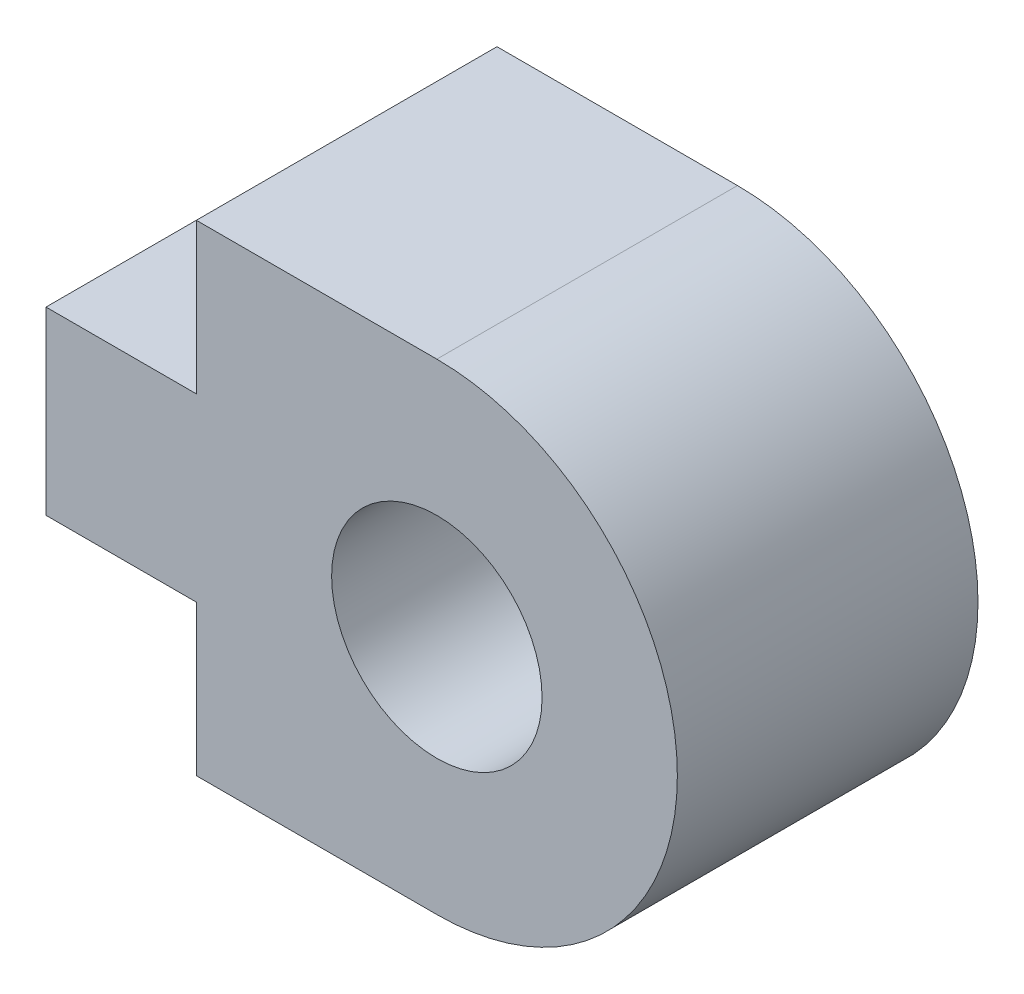
ISO-10303-21;
HEADER;
FILE_DESCRIPTION(('STEP AP214'),'2;1');
FILE_NAME('part.step','',(''),(''),'','','');
FILE_SCHEMA(('AUTOMOTIVE_DESIGN { 1 0 10303 214 1 1 1 1 }'));
ENDSEC;
DATA;
#1=APPLICATION_CONTEXT('core data for automotive mechanical design processes');
#2=APPLICATION_PROTOCOL_DEFINITION('international standard','automotive_design',2000,#1);
#3=PRODUCT_CONTEXT('',#1,'mechanical');
#4=PRODUCT('Part','Part','',(#3));
#5=PRODUCT_RELATED_PRODUCT_CATEGORY('part','',(#4));
#6=PRODUCT_DEFINITION_FORMATION('','',#4);
#7=PRODUCT_DEFINITION_CONTEXT('part definition',#1,'design');
#8=PRODUCT_DEFINITION('design','',#6,#7);
#9=PRODUCT_DEFINITION_SHAPE('','',#8);
#10=(LENGTH_UNIT() NAMED_UNIT(*) SI_UNIT(.MILLI.,.METRE.));
#11=(NAMED_UNIT(*) PLANE_ANGLE_UNIT() SI_UNIT($,.RADIAN.));
#12=(NAMED_UNIT(*) SI_UNIT($,.STERADIAN.) SOLID_ANGLE_UNIT());
#13=UNCERTAINTY_MEASURE_WITH_UNIT(LENGTH_MEASURE(1.E-05),#10,'distance_accuracy_value','');
#14=(GEOMETRIC_REPRESENTATION_CONTEXT(3) GLOBAL_UNCERTAINTY_ASSIGNED_CONTEXT((#13)) GLOBAL_UNIT_ASSIGNED_CONTEXT((#10,
#11,#12)) REPRESENTATION_CONTEXT('',''));
#15=CARTESIAN_POINT('',(0.,0.,0.));
#16=DIRECTION('',(0.,0.,1.));
#17=DIRECTION('',(1.,0.,0.));
#18=AXIS2_PLACEMENT_3D('',#15,#16,#17);
#19=CARTESIAN_POINT('',(0.,0.,2.5));
#20=DIRECTION('',(0.,0.,1.));
#21=DIRECTION('',(1.,0.,0.));
#22=AXIS2_PLACEMENT_3D('',#19,#20,#21);
#23=PLANE('',#22);
#24=DIRECTION('',(0.,-1.,0.));
#25=VECTOR('',#24,1.);
#26=CARTESIAN_POINT('',(-4.,1.5,2.5));
#27=LINE('',#26,#25);
#28=CARTESIAN_POINT('',(-4.,4.,2.5));
#29=VERTEX_POINT('',#28);
#30=CARTESIAN_POINT('',(-4.,1.5,2.5));
#31=VERTEX_POINT('',#30);
#32=EDGE_CURVE('E154',#29,#31,#27,.T.);
#33=ORIENTED_EDGE('',*,*,#32,.T.);
#34=DIRECTION('',(-1.,0.,0.));
#35=VECTOR('',#34,1.);
#36=CARTESIAN_POINT('',(-4.,1.5,2.5));
#37=LINE('',#36,#35);
#38=CARTESIAN_POINT('',(-6.5,1.5,2.5));
#39=VERTEX_POINT('',#38);
#40=EDGE_CURVE('E102',#31,#39,#37,.T.);
#41=ORIENTED_EDGE('',*,*,#40,.T.);
#42=DIRECTION('',(0.,-1.,0.));
#43=VECTOR('',#42,1.);
#44=CARTESIAN_POINT('',(-6.5,1.5,2.5));
#45=LINE('',#44,#43);
#46=CARTESIAN_POINT('',(-6.5,-1.5,2.5));
#47=VERTEX_POINT('',#46);
#48=EDGE_CURVE('E169',#39,#47,#45,.T.);
#49=ORIENTED_EDGE('',*,*,#48,.T.);
#50=DIRECTION('',(1.,0.,0.));
#51=VECTOR('',#50,1.);
#52=CARTESIAN_POINT('',(-6.5,-1.5,2.5));
#53=LINE('',#52,#51);
#54=CARTESIAN_POINT('',(-4.,-1.5,2.5));
#55=VERTEX_POINT('',#54);
#56=EDGE_CURVE('E182',#47,#55,#53,.T.);
#57=ORIENTED_EDGE('',*,*,#56,.T.);
#58=DIRECTION('',(0.,-1.,0.));
#59=VECTOR('',#58,1.);
#60=CARTESIAN_POINT('',(-4.,-4.,2.5));
#61=LINE('',#60,#59);
#62=CARTESIAN_POINT('',(-4.,-4.,2.5));
#63=VERTEX_POINT('',#62);
#64=EDGE_CURVE('E121',#55,#63,#61,.T.);
#65=ORIENTED_EDGE('',*,*,#64,.T.);
#66=DIRECTION('',(1.,0.,0.));
#67=VECTOR('',#66,1.);
#68=CARTESIAN_POINT('',(0.,-4.,2.5));
#69=LINE('',#68,#67);
#70=CARTESIAN_POINT('',(0.,-3.99999999999999,2.5));
#71=VERTEX_POINT('',#70);
#72=EDGE_CURVE('E115',#63,#71,#69,.T.);
#73=ORIENTED_EDGE('',*,*,#72,.T.);
#74=CARTESIAN_POINT('',(0.,0.,2.5));
#75=DIRECTION('',(0.,0.,1.));
#76=DIRECTION('',(1.,0.,0.));
#77=AXIS2_PLACEMENT_3D('',#74,#75,#76);
#78=CIRCLE('',#77,3.99999999999999);
#79=CARTESIAN_POINT('',(0.,3.99999999999999,2.5));
#80=VERTEX_POINT('',#79);
#81=EDGE_CURVE('E119',#71,#80,#78,.T.);
#82=ORIENTED_EDGE('',*,*,#81,.T.);
#83=DIRECTION('',(-1.,0.,0.));
#84=VECTOR('',#83,1.);
#85=CARTESIAN_POINT('',(0.,3.99999999999999,2.5));
#86=LINE('',#85,#84);
#87=EDGE_CURVE('E59',#80,#29,#86,.T.);
#88=ORIENTED_EDGE('',*,*,#87,.T.);
#89=EDGE_LOOP('',(#33,#41,#49,#57,#65,#73,#82,#88));
#90=FACE_BOUND('',#89,.T.);
#91=CARTESIAN_POINT('',(0.,0.,2.5));
#92=DIRECTION('',(0.,0.,1.));
#93=DIRECTION('',(1.,0.,0.));
#94=AXIS2_PLACEMENT_3D('',#91,#92,#93);
#95=CIRCLE('',#94,1.75);
#96=CARTESIAN_POINT('',(1.75,0.,2.5));
#97=VERTEX_POINT('',#96);
#98=EDGE_CURVE('E143',#97,#97,#95,.T.);
#99=ORIENTED_EDGE('',*,*,#98,.F.);
#100=EDGE_LOOP('',(#99));
#101=FACE_BOUND('',#100,.T.);
#102=ADVANCED_FACE('F42',(#90,#101),#23,.T.);
#103=CARTESIAN_POINT('',(0.,0.,-2.5));
#104=DIRECTION('',(0.,0.,1.));
#105=DIRECTION('',(1.,0.,0.));
#106=AXIS2_PLACEMENT_3D('',#103,#104,#105);
#107=PLANE('',#106);
#108=DIRECTION('',(0.,-1.,0.));
#109=VECTOR('',#108,1.);
#110=CARTESIAN_POINT('',(-4.,1.5,-2.5));
#111=LINE('',#110,#109);
#112=CARTESIAN_POINT('',(-4.,4.,-2.5));
#113=VERTEX_POINT('',#112);
#114=CARTESIAN_POINT('',(-4.,1.5,-2.5));
#115=VERTEX_POINT('',#114);
#116=EDGE_CURVE('E139',#113,#115,#111,.T.);
#117=ORIENTED_EDGE('',*,*,#116,.F.);
#118=DIRECTION('',(-1.,0.,0.));
#119=VECTOR('',#118,1.);
#120=CARTESIAN_POINT('',(0.,3.99999999999999,-2.5));
#121=LINE('',#120,#119);
#122=CARTESIAN_POINT('',(0.,3.99999999999999,-2.5));
#123=VERTEX_POINT('',#122);
#124=EDGE_CURVE('E94',#123,#113,#121,.T.);
#125=ORIENTED_EDGE('',*,*,#124,.F.);
#126=CARTESIAN_POINT('',(0.,0.,-2.5));
#127=DIRECTION('',(0.,0.,1.));
#128=DIRECTION('',(1.,0.,0.));
#129=AXIS2_PLACEMENT_3D('',#126,#127,#128);
#130=CIRCLE('',#129,3.99999999999999);
#131=CARTESIAN_POINT('',(0.,-3.99999999999999,-2.5));
#132=VERTEX_POINT('',#131);
#133=EDGE_CURVE('E88',#132,#123,#130,.T.);
#134=ORIENTED_EDGE('',*,*,#133,.F.);
#135=DIRECTION('',(1.,0.,0.));
#136=VECTOR('',#135,1.);
#137=CARTESIAN_POINT('',(0.,-4.,-2.5));
#138=LINE('',#137,#136);
#139=CARTESIAN_POINT('',(-4.,-4.,-2.5));
#140=VERTEX_POINT('',#139);
#141=EDGE_CURVE('E129',#140,#132,#138,.T.);
#142=ORIENTED_EDGE('',*,*,#141,.F.);
#143=DIRECTION('',(0.,-1.,0.));
#144=VECTOR('',#143,1.);
#145=CARTESIAN_POINT('',(-4.,-4.,-2.5));
#146=LINE('',#145,#144);
#147=CARTESIAN_POINT('',(-4.,-1.5,-2.5));
#148=VERTEX_POINT('',#147);
#149=EDGE_CURVE('E149',#148,#140,#146,.T.);
#150=ORIENTED_EDGE('',*,*,#149,.F.);
#151=DIRECTION('',(1.,0.,0.));
#152=VECTOR('',#151,1.);
#153=CARTESIAN_POINT('',(-6.5,-1.5,-2.5));
#154=LINE('',#153,#152);
#155=CARTESIAN_POINT('',(-6.5,-1.5,-2.5));
#156=VERTEX_POINT('',#155);
#157=EDGE_CURVE('E147',#156,#148,#154,.T.);
#158=ORIENTED_EDGE('',*,*,#157,.F.);
#159=DIRECTION('',(0.,-1.,0.));
#160=VECTOR('',#159,1.);
#161=CARTESIAN_POINT('',(-6.5,1.5,-2.5));
#162=LINE('',#161,#160);
#163=CARTESIAN_POINT('',(-6.5,1.5,-2.5));
#164=VERTEX_POINT('',#163);
#165=EDGE_CURVE('E145',#164,#156,#162,.T.);
#166=ORIENTED_EDGE('',*,*,#165,.F.);
#167=DIRECTION('',(-1.,0.,0.));
#168=VECTOR('',#167,1.);
#169=CARTESIAN_POINT('',(-4.,1.5,-2.5));
#170=LINE('',#169,#168);
#171=EDGE_CURVE('E142',#115,#164,#170,.T.);
#172=ORIENTED_EDGE('',*,*,#171,.F.);
#173=EDGE_LOOP('',(#117,#125,#134,#142,#150,#158,#166,#172));
#174=FACE_BOUND('',#173,.T.);
#175=CARTESIAN_POINT('',(0.,0.,-2.5));
#176=DIRECTION('',(0.,0.,1.));
#177=DIRECTION('',(1.,0.,0.));
#178=AXIS2_PLACEMENT_3D('',#175,#176,#177);
#179=CIRCLE('',#178,1.75);
#180=CARTESIAN_POINT('',(1.75,0.,-2.5));
#181=VERTEX_POINT('',#180);
#182=EDGE_CURVE('E188',#181,#181,#179,.T.);
#183=ORIENTED_EDGE('',*,*,#182,.T.);
#184=EDGE_LOOP('',(#183));
#185=FACE_BOUND('',#184,.T.);
#186=ADVANCED_FACE('F173',(#174,#185),#107,.F.);
#187=CARTESIAN_POINT('',(-4.,1.5,2.5));
#188=DIRECTION('',(1.,0.,0.));
#189=DIRECTION('',(0.,0.,-1.));
#190=AXIS2_PLACEMENT_3D('',#187,#188,#189);
#191=PLANE('',#190);
#192=ORIENTED_EDGE('',*,*,#116,.T.);
#193=DIRECTION('',(0.,0.,-1.));
#194=VECTOR('',#193,1.);
#195=CARTESIAN_POINT('',(-4.,1.5,2.5));
#196=LINE('',#195,#194);
#197=EDGE_CURVE('E11',#31,#115,#196,.T.);
#198=ORIENTED_EDGE('',*,*,#197,.F.);
#199=ORIENTED_EDGE('',*,*,#32,.F.);
#200=DIRECTION('',(0.,0.,-1.));
#201=VECTOR('',#200,1.);
#202=CARTESIAN_POINT('',(-4.,4.,2.5));
#203=LINE('',#202,#201);
#204=EDGE_CURVE('E135',#29,#113,#203,.T.);
#205=ORIENTED_EDGE('',*,*,#204,.T.);
#206=EDGE_LOOP('',(#192,#198,#199,#205));
#207=FACE_BOUND('',#206,.T.);
#208=ADVANCED_FACE('F44',(#207),#191,.F.);
#209=CARTESIAN_POINT('',(-4.,1.5,2.5));
#210=DIRECTION('',(0.,-1.,0.));
#211=DIRECTION('',(1.,0.,0.));
#212=AXIS2_PLACEMENT_3D('',#209,#210,#211);
#213=PLANE('',#212);
#214=ORIENTED_EDGE('',*,*,#171,.T.);
#215=DIRECTION('',(0.,0.,-1.));
#216=VECTOR('',#215,1.);
#217=CARTESIAN_POINT('',(-6.5,1.5,2.5));
#218=LINE('',#217,#216);
#219=EDGE_CURVE('E51',#39,#164,#218,.T.);
#220=ORIENTED_EDGE('',*,*,#219,.F.);
#221=ORIENTED_EDGE('',*,*,#40,.F.);
#222=ORIENTED_EDGE('',*,*,#197,.T.);
#223=EDGE_LOOP('',(#214,#220,#221,#222));
#224=FACE_BOUND('',#223,.T.);
#225=ADVANCED_FACE('F216',(#224),#213,.F.);
#226=CARTESIAN_POINT('',(-6.5,1.5,2.5));
#227=DIRECTION('',(1.,0.,0.));
#228=DIRECTION('',(0.,0.,-1.));
#229=AXIS2_PLACEMENT_3D('',#226,#227,#228);
#230=PLANE('',#229);
#231=ORIENTED_EDGE('',*,*,#165,.T.);
#232=DIRECTION('',(0.,0.,-1.));
#233=VECTOR('',#232,1.);
#234=CARTESIAN_POINT('',(-6.5,-1.5,2.5));
#235=LINE('',#234,#233);
#236=EDGE_CURVE('E161',#47,#156,#235,.T.);
#237=ORIENTED_EDGE('',*,*,#236,.F.);
#238=ORIENTED_EDGE('',*,*,#48,.F.);
#239=ORIENTED_EDGE('',*,*,#219,.T.);
#240=EDGE_LOOP('',(#231,#237,#238,#239));
#241=FACE_BOUND('',#240,.T.);
#242=ADVANCED_FACE('F167',(#241),#230,.F.);
#243=CARTESIAN_POINT('',(-6.5,-1.5,2.5));
#244=DIRECTION('',(0.,1.,0.));
#245=DIRECTION('',(-1.,0.,0.));
#246=AXIS2_PLACEMENT_3D('',#243,#244,#245);
#247=PLANE('',#246);
#248=ORIENTED_EDGE('',*,*,#157,.T.);
#249=DIRECTION('',(0.,0.,-1.));
#250=VECTOR('',#249,1.);
#251=CARTESIAN_POINT('',(-4.,-1.5,2.5));
#252=LINE('',#251,#250);
#253=EDGE_CURVE('E158',#55,#148,#252,.T.);
#254=ORIENTED_EDGE('',*,*,#253,.F.);
#255=ORIENTED_EDGE('',*,*,#56,.F.);
#256=ORIENTED_EDGE('',*,*,#236,.T.);
#257=EDGE_LOOP('',(#248,#254,#255,#256));
#258=FACE_BOUND('',#257,.T.);
#259=ADVANCED_FACE('F178',(#258),#247,.F.);
#260=CARTESIAN_POINT('',(-4.,-4.,2.5));
#261=DIRECTION('',(1.,0.,0.));
#262=DIRECTION('',(0.,0.,-1.));
#263=AXIS2_PLACEMENT_3D('',#260,#261,#262);
#264=PLANE('',#263);
#265=ORIENTED_EDGE('',*,*,#149,.T.);
#266=DIRECTION('',(0.,0.,-1.));
#267=VECTOR('',#266,1.);
#268=CARTESIAN_POINT('',(-4.,-4.,2.5));
#269=LINE('',#268,#267);
#270=EDGE_CURVE('E130',#63,#140,#269,.T.);
#271=ORIENTED_EDGE('',*,*,#270,.F.);
#272=ORIENTED_EDGE('',*,*,#64,.F.);
#273=ORIENTED_EDGE('',*,*,#253,.T.);
#274=EDGE_LOOP('',(#265,#271,#272,#273));
#275=FACE_BOUND('',#274,.T.);
#276=ADVANCED_FACE('F181',(#275),#264,.F.);
#277=CARTESIAN_POINT('',(0.,-4.,2.5));
#278=DIRECTION('',(0.,1.,0.));
#279=DIRECTION('',(0.,0.,1.));
#280=AXIS2_PLACEMENT_3D('',#277,#278,#279);
#281=PLANE('',#280);
#282=ORIENTED_EDGE('',*,*,#141,.T.);
#283=DIRECTION('',(0.,0.,-1.));
#284=VECTOR('',#283,1.);
#285=CARTESIAN_POINT('',(0.,-3.99999999999999,2.5));
#286=LINE('',#285,#284);
#287=EDGE_CURVE('E126',#71,#132,#286,.T.);
#288=ORIENTED_EDGE('',*,*,#287,.F.);
#289=ORIENTED_EDGE('',*,*,#72,.F.);
#290=ORIENTED_EDGE('',*,*,#270,.T.);
#291=EDGE_LOOP('',(#282,#288,#289,#290));
#292=FACE_BOUND('',#291,.T.);
#293=ADVANCED_FACE('F127',(#292),#281,.F.);
#294=CARTESIAN_POINT('',(0.,0.,2.5));
#295=DIRECTION('',(0.,0.,-1.));
#296=DIRECTION('',(-1.,0.,0.));
#297=AXIS2_PLACEMENT_3D('',#294,#295,#296);
#298=CYLINDRICAL_SURFACE('',#297,3.99999999999999);
#299=ORIENTED_EDGE('',*,*,#133,.T.);
#300=DIRECTION('',(0.,0.,-1.));
#301=VECTOR('',#300,1.);
#302=CARTESIAN_POINT('',(0.,3.99999999999999,2.5));
#303=LINE('',#302,#301);
#304=EDGE_CURVE('E131',#80,#123,#303,.T.);
#305=ORIENTED_EDGE('',*,*,#304,.F.);
#306=ORIENTED_EDGE('',*,*,#81,.F.);
#307=ORIENTED_EDGE('',*,*,#287,.T.);
#308=EDGE_LOOP('',(#299,#305,#306,#307));
#309=FACE_BOUND('',#308,.T.);
#310=ADVANCED_FACE('F133',(#309),#298,.T.);
#311=CARTESIAN_POINT('',(0.,3.99999999999999,2.5));
#312=DIRECTION('',(0.,-1.,0.));
#313=DIRECTION('',(1.,0.,0.));
#314=AXIS2_PLACEMENT_3D('',#311,#312,#313);
#315=PLANE('',#314);
#316=ORIENTED_EDGE('',*,*,#124,.T.);
#317=ORIENTED_EDGE('',*,*,#204,.F.);
#318=ORIENTED_EDGE('',*,*,#87,.F.);
#319=ORIENTED_EDGE('',*,*,#304,.T.);
#320=EDGE_LOOP('',(#316,#317,#318,#319));
#321=FACE_BOUND('',#320,.T.);
#322=ADVANCED_FACE('F204',(#321),#315,.F.);
#323=CARTESIAN_POINT('',(0.,0.,2.5));
#324=DIRECTION('',(0.,0.,-1.));
#325=DIRECTION('',(-1.,0.,0.));
#326=AXIS2_PLACEMENT_3D('',#323,#324,#325);
#327=CYLINDRICAL_SURFACE('',#326,1.75);
#328=ORIENTED_EDGE('',*,*,#98,.T.);
#329=EDGE_LOOP('',(#328));
#330=FACE_BOUND('',#329,.T.);
#331=ORIENTED_EDGE('',*,*,#182,.F.);
#332=EDGE_LOOP('',(#331));
#333=FACE_BOUND('',#332,.T.);
#334=ADVANCED_FACE('F194',(#330,#333),#327,.F.);
#335=CLOSED_SHELL('',(#102,#186,#208,#225,#242,#259,#276,#293,#310,#322,#334));
#336=MANIFOLD_SOLID_BREP('B2',#335);
#337=ADVANCED_BREP_SHAPE_REPRESENTATION('',(#18,#336),#14);
#338=SHAPE_DEFINITION_REPRESENTATION(#9,#337);
ENDSEC;
END-ISO-10303-21;
